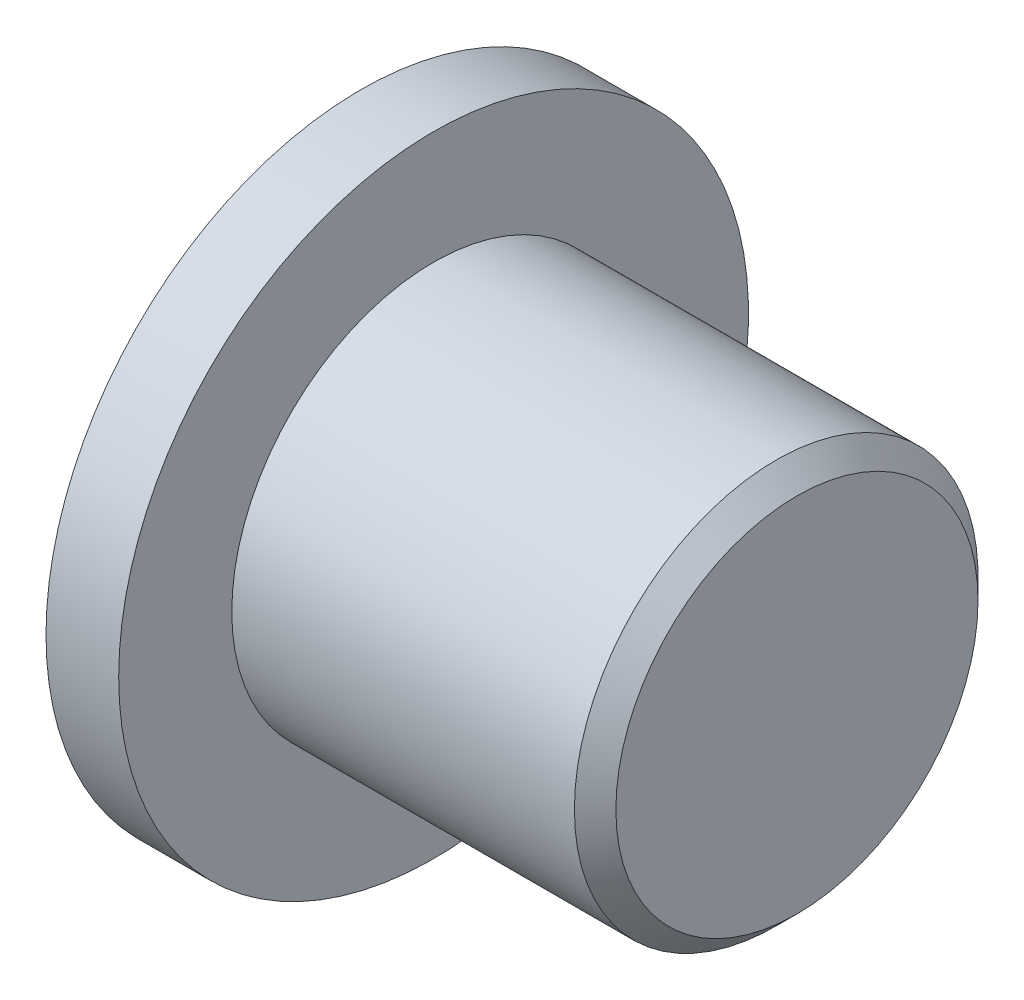
ISO-10303-21;
HEADER;
FILE_DESCRIPTION(('STEP AP214'),'2;1');
FILE_NAME('part.step','',(''),(''),'','','');
FILE_SCHEMA(('AUTOMOTIVE_DESIGN { 1 0 10303 214 1 1 1 1 }'));
ENDSEC;
DATA;
#1=APPLICATION_CONTEXT('core data for automotive mechanical design processes');
#2=APPLICATION_PROTOCOL_DEFINITION('international standard','automotive_design',2000,#1);
#3=PRODUCT_CONTEXT('',#1,'mechanical');
#4=PRODUCT('Part','Part','',(#3));
#5=PRODUCT_RELATED_PRODUCT_CATEGORY('part','',(#4));
#6=PRODUCT_DEFINITION_FORMATION('','',#4);
#7=PRODUCT_DEFINITION_CONTEXT('part definition',#1,'design');
#8=PRODUCT_DEFINITION('design','',#6,#7);
#9=PRODUCT_DEFINITION_SHAPE('','',#8);
#10=(LENGTH_UNIT() NAMED_UNIT(*) SI_UNIT(.MILLI.,.METRE.));
#11=(NAMED_UNIT(*) PLANE_ANGLE_UNIT() SI_UNIT($,.RADIAN.));
#12=(NAMED_UNIT(*) SI_UNIT($,.STERADIAN.) SOLID_ANGLE_UNIT());
#13=UNCERTAINTY_MEASURE_WITH_UNIT(LENGTH_MEASURE(1.E-05),#10,'distance_accuracy_value','');
#14=(GEOMETRIC_REPRESENTATION_CONTEXT(3) GLOBAL_UNCERTAINTY_ASSIGNED_CONTEXT((#13)) GLOBAL_UNIT_ASSIGNED_CONTEXT((#10,
#11,#12)) REPRESENTATION_CONTEXT('',''));
#15=CARTESIAN_POINT('',(0.,0.,0.));
#16=DIRECTION('',(0.,0.,1.));
#17=DIRECTION('',(1.,0.,0.));
#18=AXIS2_PLACEMENT_3D('',#15,#16,#17);
#19=CARTESIAN_POINT('',(-3.,0.,0.));
#20=DIRECTION('',(1.,0.,0.));
#21=DIRECTION('',(0.,0.,-1.));
#22=AXIS2_PLACEMENT_3D('',#19,#20,#21);
#23=CYLINDRICAL_SURFACE('',#22,13.);
#24=CARTESIAN_POINT('',(-3.,0.,0.));
#25=DIRECTION('',(-1.,0.,0.));
#26=DIRECTION('',(0.,0.,1.));
#27=AXIS2_PLACEMENT_3D('',#24,#25,#26);
#28=CIRCLE('',#27,13.);
#29=CARTESIAN_POINT('',(-3.,0.,13.));
#30=VERTEX_POINT('',#29);
#31=EDGE_CURVE('E10',#30,#30,#28,.T.);
#32=ORIENTED_EDGE('',*,*,#31,.F.);
#33=EDGE_LOOP('',(#32));
#34=FACE_BOUND('',#33,.T.);
#35=CARTESIAN_POINT('',(0.,0.,0.));
#36=DIRECTION('',(-1.,0.,0.));
#37=DIRECTION('',(0.,0.,1.));
#38=AXIS2_PLACEMENT_3D('',#35,#36,#37);
#39=CIRCLE('',#38,13.);
#40=CARTESIAN_POINT('',(0.,0.,13.));
#41=VERTEX_POINT('',#40);
#42=EDGE_CURVE('E48',#41,#41,#39,.T.);
#43=ORIENTED_EDGE('',*,*,#42,.T.);
#44=EDGE_LOOP('',(#43));
#45=FACE_BOUND('',#44,.T.);
#46=ADVANCED_FACE('F44',(#34,#45),#23,.T.);
#47=CARTESIAN_POINT('',(-3.,0.,0.));
#48=DIRECTION('',(-1.,0.,0.));
#49=DIRECTION('',(0.,0.,1.));
#50=AXIS2_PLACEMENT_3D('',#47,#48,#49);
#51=PLANE('',#50);
#52=ORIENTED_EDGE('',*,*,#31,.T.);
#53=EDGE_LOOP('',(#52));
#54=FACE_BOUND('',#53,.T.);
#55=ADVANCED_FACE('F84',(#54),#51,.T.);
#56=CARTESIAN_POINT('',(0.,0.,0.));
#57=DIRECTION('',(-1.,0.,0.));
#58=DIRECTION('',(0.,0.,1.));
#59=AXIS2_PLACEMENT_3D('',#56,#57,#58);
#60=PLANE('',#59);
#61=ORIENTED_EDGE('',*,*,#42,.F.);
#62=EDGE_LOOP('',(#61));
#63=FACE_BOUND('',#62,.T.);
#64=CARTESIAN_POINT('',(0.,0.,0.));
#65=DIRECTION('',(-1.,0.,0.));
#66=DIRECTION('',(0.,0.,1.));
#67=AXIS2_PLACEMENT_3D('',#64,#65,#66);
#68=CIRCLE('',#67,8.331);
#69=CARTESIAN_POINT('',(0.,0.,8.331));
#70=VERTEX_POINT('',#69);
#71=EDGE_CURVE('E57',#70,#70,#68,.T.);
#72=ORIENTED_EDGE('',*,*,#71,.T.);
#73=EDGE_LOOP('',(#72));
#74=FACE_BOUND('',#73,.T.);
#75=ADVANCED_FACE('F89',(#63,#74),#60,.F.);
#76=CARTESIAN_POINT('',(15.,0.,0.));
#77=DIRECTION('',(-1.,0.,0.));
#78=DIRECTION('',(0.,0.,1.));
#79=AXIS2_PLACEMENT_3D('',#76,#77,#78);
#80=CYLINDRICAL_SURFACE('',#79,8.331);
#81=ORIENTED_EDGE('',*,*,#71,.F.);
#82=EDGE_LOOP('',(#81));
#83=FACE_BOUND('',#82,.T.);
#84=CARTESIAN_POINT('',(14.144,0.,0.));
#85=DIRECTION('',(-1.,0.,0.));
#86=DIRECTION('',(0.,0.,1.));
#87=AXIS2_PLACEMENT_3D('',#84,#85,#86);
#88=CIRCLE('',#87,8.331);
#89=CARTESIAN_POINT('',(14.144,0.,8.331));
#90=VERTEX_POINT('',#89);
#91=EDGE_CURVE('E66',#90,#90,#88,.T.);
#92=ORIENTED_EDGE('',*,*,#91,.T.);
#93=EDGE_LOOP('',(#92));
#94=FACE_BOUND('',#93,.T.);
#95=ADVANCED_FACE('F71',(#83,#94),#80,.T.);
#96=CARTESIAN_POINT('',(15.,0.,0.));
#97=DIRECTION('',(-1.,0.,0.));
#98=DIRECTION('',(0.,0.,1.));
#99=AXIS2_PLACEMENT_3D('',#96,#97,#98);
#100=CONICAL_SURFACE('',#99,7.475,0.785398163397456);
#101=ORIENTED_EDGE('',*,*,#91,.F.);
#102=EDGE_LOOP('',(#101));
#103=FACE_BOUND('',#102,.T.);
#104=CARTESIAN_POINT('',(15.,0.,0.));
#105=DIRECTION('',(-1.,0.,0.));
#106=DIRECTION('',(0.,0.,1.));
#107=AXIS2_PLACEMENT_3D('',#104,#105,#106);
#108=CIRCLE('',#107,7.475);
#109=CARTESIAN_POINT('',(15.,0.,7.475));
#110=VERTEX_POINT('',#109);
#111=EDGE_CURVE('E62',#110,#110,#108,.T.);
#112=ORIENTED_EDGE('',*,*,#111,.T.);
#113=EDGE_LOOP('',(#112));
#114=FACE_BOUND('',#113,.T.);
#115=ADVANCED_FACE('F73',(#103,#114),#100,.T.);
#116=CARTESIAN_POINT('',(15.,0.,0.));
#117=DIRECTION('',(1.,0.,0.));
#118=DIRECTION('',(0.,0.,-1.));
#119=AXIS2_PLACEMENT_3D('',#116,#117,#118);
#120=PLANE('',#119);
#121=ORIENTED_EDGE('',*,*,#111,.F.);
#122=EDGE_LOOP('',(#121));
#123=FACE_BOUND('',#122,.T.);
#124=ADVANCED_FACE('F46',(#123),#120,.T.);
#125=CLOSED_SHELL('',(#46,#55,#75,#95,#115,#124));
#126=MANIFOLD_SOLID_BREP('B2',#125);
#127=ADVANCED_BREP_SHAPE_REPRESENTATION('',(#18,#126),#14);
#128=SHAPE_DEFINITION_REPRESENTATION(#9,#127);
ENDSEC;
END-ISO-10303-21;
